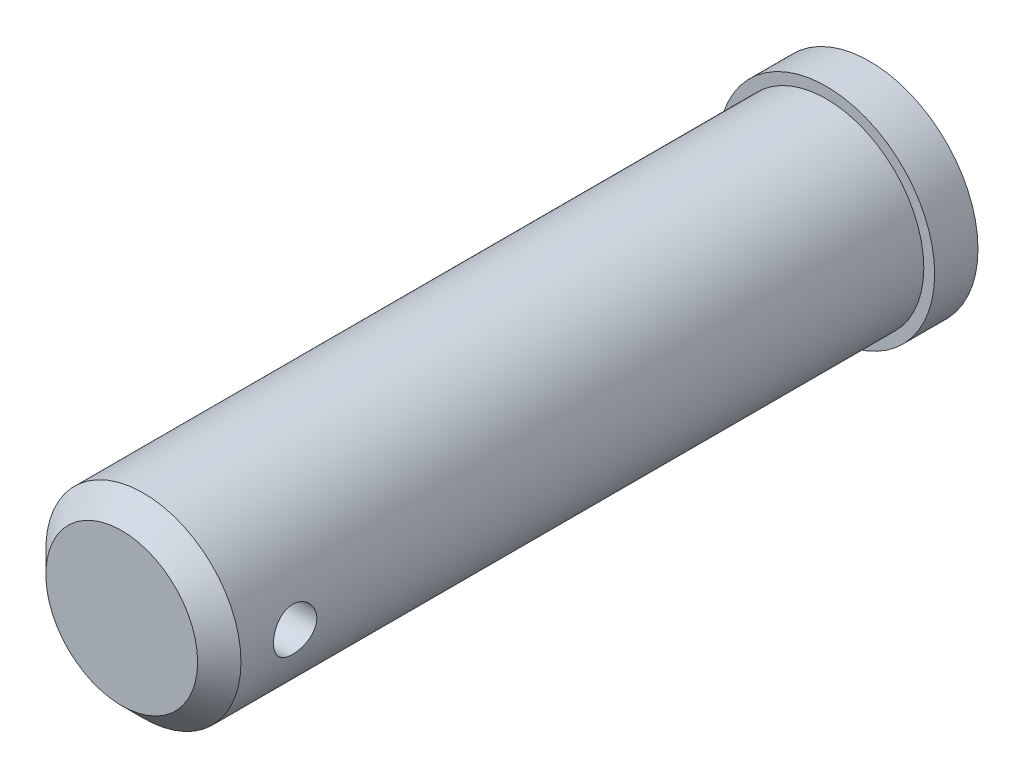
ISO-10303-21;
HEADER;
FILE_DESCRIPTION(('STEP AP214'),'2;1');
FILE_NAME('part.step','',(''),(''),'','','');
FILE_SCHEMA(('AUTOMOTIVE_DESIGN { 1 0 10303 214 1 1 1 1 }'));
ENDSEC;
DATA;
#1=APPLICATION_CONTEXT('core data for automotive mechanical design processes');
#2=APPLICATION_PROTOCOL_DEFINITION('international standard','automotive_design',2000,#1);
#3=PRODUCT_CONTEXT('',#1,'mechanical');
#4=PRODUCT('Part','Part','',(#3));
#5=PRODUCT_RELATED_PRODUCT_CATEGORY('part','',(#4));
#6=PRODUCT_DEFINITION_FORMATION('','',#4);
#7=PRODUCT_DEFINITION_CONTEXT('part definition',#1,'design');
#8=PRODUCT_DEFINITION('design','',#6,#7);
#9=PRODUCT_DEFINITION_SHAPE('','',#8);
#10=(LENGTH_UNIT() NAMED_UNIT(*) SI_UNIT(.MILLI.,.METRE.));
#11=(NAMED_UNIT(*) PLANE_ANGLE_UNIT() SI_UNIT($,.RADIAN.));
#12=(NAMED_UNIT(*) SI_UNIT($,.STERADIAN.) SOLID_ANGLE_UNIT());
#13=UNCERTAINTY_MEASURE_WITH_UNIT(LENGTH_MEASURE(1.E-05),#10,'distance_accuracy_value','');
#14=(GEOMETRIC_REPRESENTATION_CONTEXT(3) GLOBAL_UNCERTAINTY_ASSIGNED_CONTEXT((#13)) GLOBAL_UNIT_ASSIGNED_CONTEXT((#10,
#11,#12)) REPRESENTATION_CONTEXT('',''));
#15=CARTESIAN_POINT('',(0.,0.,0.));
#16=DIRECTION('',(0.,0.,1.));
#17=DIRECTION('',(1.,0.,0.));
#18=AXIS2_PLACEMENT_3D('',#15,#16,#17);
#19=CARTESIAN_POINT('',(0.,0.,69.));
#20=DIRECTION('',(0.,0.,-1.));
#21=DIRECTION('',(-1.,0.,0.));
#22=AXIS2_PLACEMENT_3D('',#19,#20,#21);
#23=CONICAL_SURFACE('',#22,7.,0.785398163397448);
#24=CARTESIAN_POINT('',(0.,0.,69.));
#25=DIRECTION('',(0.,0.,1.));
#26=DIRECTION('',(1.,0.,0.));
#27=AXIS2_PLACEMENT_3D('',#24,#25,#26);
#28=CIRCLE('',#27,7.);
#29=CARTESIAN_POINT('',(7.,0.,69.));
#30=VERTEX_POINT('',#29);
#31=EDGE_CURVE('E61',#30,#30,#28,.T.);
#32=ORIENTED_EDGE('',*,*,#31,.F.);
#33=EDGE_LOOP('',(#32));
#34=FACE_BOUND('',#33,.T.);
#35=CARTESIAN_POINT('',(0.,0.,67.));
#36=DIRECTION('',(0.,0.,1.));
#37=DIRECTION('',(1.,0.,0.));
#38=AXIS2_PLACEMENT_3D('',#35,#36,#37);
#39=CIRCLE('',#38,9.);
#40=CARTESIAN_POINT('',(9.,0.,67.));
#41=VERTEX_POINT('',#40);
#42=EDGE_CURVE('E12',#41,#41,#39,.F.);
#43=ORIENTED_EDGE('',*,*,#42,.F.);
#44=EDGE_LOOP('',(#43));
#45=FACE_BOUND('',#44,.T.);
#46=ADVANCED_FACE('F47',(#34,#45),#23,.T.);
#47=CARTESIAN_POINT('',(0.,0.,4.));
#48=DIRECTION('',(0.,0.,-1.));
#49=DIRECTION('',(-1.,0.,0.));
#50=AXIS2_PLACEMENT_3D('',#47,#48,#49);
#51=CYLINDRICAL_SURFACE('',#50,10.);
#52=CARTESIAN_POINT('',(0.,0.,4.));
#53=DIRECTION('',(0.,0.,1.));
#54=DIRECTION('',(1.,0.,0.));
#55=AXIS2_PLACEMENT_3D('',#52,#53,#54);
#56=CIRCLE('',#55,10.);
#57=CARTESIAN_POINT('',(10.,0.,4.));
#58=VERTEX_POINT('',#57);
#59=EDGE_CURVE('E118',#58,#58,#56,.T.);
#60=ORIENTED_EDGE('',*,*,#59,.F.);
#61=EDGE_LOOP('',(#60));
#62=FACE_BOUND('',#61,.T.);
#63=CARTESIAN_POINT('',(0.,0.,0.));
#64=DIRECTION('',(0.,0.,1.));
#65=DIRECTION('',(1.,0.,0.));
#66=AXIS2_PLACEMENT_3D('',#63,#64,#65);
#67=CIRCLE('',#66,10.);
#68=CARTESIAN_POINT('',(10.,0.,0.));
#69=VERTEX_POINT('',#68);
#70=EDGE_CURVE('E116',#69,#69,#67,.T.);
#71=ORIENTED_EDGE('',*,*,#70,.T.);
#72=EDGE_LOOP('',(#71));
#73=FACE_BOUND('',#72,.T.);
#74=ADVANCED_FACE('F94',(#62,#73),#51,.T.);
#75=CARTESIAN_POINT('',(0.,0.,4.));
#76=DIRECTION('',(0.,0.,1.));
#77=DIRECTION('',(1.,0.,0.));
#78=AXIS2_PLACEMENT_3D('',#75,#76,#77);
#79=PLANE('',#78);
#80=CARTESIAN_POINT('',(0.,0.,4.));
#81=DIRECTION('',(0.,0.,1.));
#82=DIRECTION('',(1.,0.,0.));
#83=AXIS2_PLACEMENT_3D('',#80,#81,#82);
#84=CIRCLE('',#83,9.);
#85=CARTESIAN_POINT('',(9.,0.,4.));
#86=VERTEX_POINT('',#85);
#87=EDGE_CURVE('E67',#86,#86,#84,.T.);
#88=ORIENTED_EDGE('',*,*,#87,.F.);
#89=EDGE_LOOP('',(#88));
#90=FACE_BOUND('',#89,.T.);
#91=ORIENTED_EDGE('',*,*,#59,.T.);
#92=EDGE_LOOP('',(#91));
#93=FACE_BOUND('',#92,.T.);
#94=ADVANCED_FACE('F99',(#90,#93),#79,.T.);
#95=CARTESIAN_POINT('',(0.,0.,0.));
#96=DIRECTION('',(0.,0.,1.));
#97=DIRECTION('',(1.,0.,0.));
#98=AXIS2_PLACEMENT_3D('',#95,#96,#97);
#99=PLANE('',#98);
#100=ORIENTED_EDGE('',*,*,#70,.F.);
#101=EDGE_LOOP('',(#100));
#102=FACE_BOUND('',#101,.T.);
#103=ADVANCED_FACE('F91',(#102),#99,.F.);
#104=CARTESIAN_POINT('',(0.,0.,69.));
#105=DIRECTION('',(0.,0.,-1.));
#106=DIRECTION('',(-1.,0.,0.));
#107=AXIS2_PLACEMENT_3D('',#104,#105,#106);
#108=CYLINDRICAL_SURFACE('',#107,9.);
#109=CARTESIAN_POINT('',(-9.,0.,64.));
#110=CARTESIAN_POINT('',(-8.99999796218252,-0.110880476775649,63.9999962763202));
#111=CARTESIAN_POINT('',(-8.99793013995692,-0.221805565269622,63.9907480183365));
#112=CARTESIAN_POINT('',(-8.9898809775767,-0.440501944103136,63.9540395276495));
#113=CARTESIAN_POINT('',(-8.98389690217348,-0.548270975138989,63.9265665659907));
#114=CARTESIAN_POINT('',(-8.96868113169008,-0.757463277761536,63.8543140295084));
#115=CARTESIAN_POINT('',(-8.95945288439082,-0.858893152100298,63.8095528230021));
#116=CARTESIAN_POINT('',(-8.93874335441377,-1.05280018031378,63.7040533875276));
#117=CARTESIAN_POINT('',(-8.92726211547358,-1.14527750793336,63.6433154687094));
#118=CARTESIAN_POINT('',(-8.9030909417421,-1.32018631401404,63.5065243348933));
#119=CARTESIAN_POINT('',(-8.89038561641427,-1.40244861204354,63.4302574978649));
#120=CARTESIAN_POINT('',(-8.86530601079787,-1.55312491045838,63.2650319399069));
#121=CARTESIAN_POINT('',(-8.85293176088049,-1.62153764410856,63.1760720592895));
#122=CARTESIAN_POINT('',(-8.82976328261711,-1.74332443410351,62.9867281559417));
#123=CARTESIAN_POINT('',(-8.81898875742981,-1.79651742104404,62.8862250419585));
#124=CARTESIAN_POINT('',(-8.80046096352395,-1.88519298954508,62.6774272383076));
#125=CARTESIAN_POINT('',(-8.79270732104771,-1.92067776220096,62.5691335144957));
#126=CARTESIAN_POINT('',(-8.78125609459189,-1.97236858006405,62.3496665226773));
#127=CARTESIAN_POINT('',(-8.77749545807783,-1.98887467038069,62.2385672848946));
#128=CARTESIAN_POINT('',(-8.77426673730669,-2.00307270997673,62.0151177822138));
#129=CARTESIAN_POINT('',(-8.77479810778939,-2.00076704911663,61.9027676780378));
#130=CARTESIAN_POINT('',(-8.78003632148146,-1.97764827517302,61.6822433728062));
#131=CARTESIAN_POINT('',(-8.78466431384841,-1.95718464460217,61.5740303758607));
#132=CARTESIAN_POINT('',(-8.79744954191676,-1.89888490681146,61.362612856675));
#133=CARTESIAN_POINT('',(-8.80560698133176,-1.86104779681652,61.2594086239146));
#134=CARTESIAN_POINT('',(-8.82460909970296,-1.76875672872875,61.0599605616181));
#135=CARTESIAN_POINT('',(-8.8354752436249,-1.71416919379353,60.9637806726639));
#136=CARTESIAN_POINT('',(-8.85865737910744,-1.5900206813985,60.7818171294841));
#137=CARTESIAN_POINT('',(-8.87097357420597,-1.52045760074274,60.6960349381798));
#138=CARTESIAN_POINT('',(-8.89600574612666,-1.36648683702983,60.5352906906515));
#139=CARTESIAN_POINT('',(-8.90872450687872,-1.28178220526623,60.4606132148949));
#140=CARTESIAN_POINT('',(-8.93287839122317,-1.10090661809162,60.3264762710929));
#141=CARTESIAN_POINT('',(-8.94431349008427,-1.00473544183737,60.2670170962181));
#142=CARTESIAN_POINT('',(-8.96465064233607,-0.803303190734731,60.1649307242232));
#143=CARTESIAN_POINT('',(-8.97354693007659,-0.69802212231985,60.1223417556917));
#144=CARTESIAN_POINT('',(-8.98776136366255,-0.481555930981454,60.0555389869421));
#145=CARTESIAN_POINT('',(-8.99308004696785,-0.370371697593364,60.0313224265859));
#146=CARTESIAN_POINT('',(-8.99946317761673,-0.147695483280844,60.0023679867448));
#147=CARTESIAN_POINT('',(-9.0006124862229,-0.0362563973189032,59.9972414998383));
#148=CARTESIAN_POINT('',(-8.99876558650597,0.185885923928082,60.0055581042604));
#149=CARTESIAN_POINT('',(-8.9957696689046,0.296589210270649,60.0189998933195));
#150=CARTESIAN_POINT('',(-8.98602258758613,0.512823257329425,60.0637494151681));
#151=CARTESIAN_POINT('',(-8.97931447007761,0.618398491715488,60.0948524562234));
#152=CARTESIAN_POINT('',(-8.96289421086795,0.822832805855836,60.1738136874451));
#153=CARTESIAN_POINT('',(-8.95318180764659,0.921691300010183,60.221673336306));
#154=CARTESIAN_POINT('',(-8.9316215322764,1.11148643989438,60.333592876799));
#155=CARTESIAN_POINT('',(-8.91974444590247,1.20228573083225,60.3978799430062));
#156=CARTESIAN_POINT('',(-8.8952303234908,1.37194696498812,60.5405312491014));
#157=CARTESIAN_POINT('',(-8.88259318550175,1.45080730173413,60.6188973803321));
#158=CARTESIAN_POINT('',(-8.8576887894581,1.59589548190986,60.7892680335807));
#159=CARTESIAN_POINT('',(-8.84543317664284,1.66185381940074,60.8815040900066));
#160=CARTESIAN_POINT('',(-8.82295395378309,1.77734611922752,61.0759720344108));
#161=CARTESIAN_POINT('',(-8.8127302549527,1.82688079926974,61.1782034853421));
#162=CARTESIAN_POINT('',(-8.79557200548926,1.90778001896259,61.3892082891051));
#163=CARTESIAN_POINT('',(-8.78861879659786,1.93924786354759,61.4979404422688));
#164=CARTESIAN_POINT('',(-8.77875649697392,1.98342027658406,61.7193241848625));
#165=CARTESIAN_POINT('',(-8.77584673547331,1.99612795718357,61.8319751210259));
#166=CARTESIAN_POINT('',(-8.77444401448977,2.00228356641044,62.0552788782783));
#167=CARTESIAN_POINT('',(-8.77585298370124,1.99615913143934,62.1659195080601));
#168=CARTESIAN_POINT('',(-8.78270664957547,1.96578277121688,62.3845497099668));
#169=CARTESIAN_POINT('',(-8.78815129547033,1.9415310740024,62.4925393154235));
#170=CARTESIAN_POINT('',(-8.80241428131525,1.87579819980744,62.7024491202274));
#171=CARTESIAN_POINT('',(-8.8112200518277,1.83438116628454,62.8043903168816));
#172=CARTESIAN_POINT('',(-8.83121764469058,1.73554770348342,62.9999399925467));
#173=CARTESIAN_POINT('',(-8.84240972476633,1.67812954585194,63.093547569964));
#174=CARTESIAN_POINT('',(-8.8662104283533,1.54751358990558,63.271876608948));
#175=CARTESIAN_POINT('',(-8.8788437136774,1.47401185511038,63.3563722049227));
#176=CARTESIAN_POINT('',(-8.90393974173387,1.31392870594504,63.5119700739313));
#177=CARTESIAN_POINT('',(-8.91640244429053,1.22734426623344,63.5830692405084));
#178=CARTESIAN_POINT('',(-8.93995259726581,1.04214597064557,63.7107759829199));
#179=CARTESIAN_POINT('',(-8.95101923499229,0.943385636634951,63.7671751997349));
#180=CARTESIAN_POINT('',(-8.97032058369249,0.737560279778817,63.8624833041812));
#181=CARTESIAN_POINT('',(-8.97855763270815,0.630502203312991,63.9014066400462));
#182=CARTESIAN_POINT('',(-8.98982812909554,0.436138247729405,63.9538413502768));
#183=CARTESIAN_POINT('',(-8.9936186902321,0.349871991901679,63.9711173736663));
#184=CARTESIAN_POINT('',(-8.99870537459789,0.175746449894527,63.9941979043062));
#185=CARTESIAN_POINT('',(-9.00000161523613,0.0878872388928777,64.0000029515019));
#186=CARTESIAN_POINT('',(-9.,0.,64.));
#187=B_SPLINE_CURVE_WITH_KNOTS('',3,(#109,#110,#111,#112,#113,#114,#115,#116,#117,#118,#119,
#120,#121,#122,#123,#124,#125,#126,#127,#128,#129,#130,#131,#132,#133,#134,#135,#136,#137,#138,
#139,#140,#141,#142,#143,#144,#145,#146,#147,#148,#149,#150,#151,#152,#153,#154,#155,#156,#157,
#158,#159,#160,#161,#162,#163,#164,#165,#166,#167,#168,#169,#170,#171,#172,#173,#174,#175,#176,
#177,#178,#179,#180,#181,#182,#183,#184,#185,#186),.UNSPECIFIED.,.T.,.F.,(4,2,2,2,2,2,2,2,2,2,2,
2,2,2,2,2,2,2,2,2,2,2,2,2,2,2,2,2,2,2,2,2,2,2,2,2,2,2,4),(0.,0.332319689729797,
0.664871731249287,0.99707141240748,1.3292646451699,1.6663807200208,2.00352761490515,
2.34453296297978,2.6854961068774,3.02099125638107,3.35644378496592,3.68557668145785,
4.0147285774694,4.34657669709582,4.67847145258301,5.01778179808978,5.35709867969829,
5.69718012811239,6.03721047501989,6.3702799212427,6.70332600912268,7.03258869425168,
7.36188004945461,7.69599803262042,8.03016093387758,8.3706947310573,8.71121364510412,
9.04976559055244,9.38826136686412,9.71912785142418,10.0499901738286,10.3796271201578,
10.7092996858639,11.0458432631283,11.3824647846641,11.7236258704957,12.0645043787094,
12.3279234735856,12.5913301688795),.UNSPECIFIED.);
#188=CARTESIAN_POINT('',(-9.,0.,64.));
#189=VERTEX_POINT('',#188);
#190=EDGE_CURVE('E51',#189,#189,#187,.T.);
#191=ORIENTED_EDGE('',*,*,#190,.T.);
#192=EDGE_LOOP('',(#191));
#193=FACE_BOUND('',#192,.T.);
#194=CARTESIAN_POINT('',(9.,0.,60.));
#195=CARTESIAN_POINT('',(8.99999796218252,-0.110880476775649,60.0000037236798));
#196=CARTESIAN_POINT('',(8.99793013995692,-0.221805565269621,60.0092519816635));
#197=CARTESIAN_POINT('',(8.9898809775767,-0.440501944103135,60.0459604723506));
#198=CARTESIAN_POINT('',(8.98389690217348,-0.548270975138988,60.0734334340093));
#199=CARTESIAN_POINT('',(8.96868113169008,-0.757463277761528,60.1456859704916));
#200=CARTESIAN_POINT('',(8.95945288439083,-0.858893152100283,60.1904471769979));
#201=CARTESIAN_POINT('',(8.93874335441378,-1.05280018031376,60.2959466124724));
#202=CARTESIAN_POINT('',(8.92726211547358,-1.14527750793335,60.3566845312906));
#203=CARTESIAN_POINT('',(8.9030909417421,-1.32018631401404,60.4934756651067));
#204=CARTESIAN_POINT('',(8.89038561641427,-1.40244861204354,60.5697425021351));
#205=CARTESIAN_POINT('',(8.86530601079787,-1.55312491045838,60.7349680600931));
#206=CARTESIAN_POINT('',(8.85293176088049,-1.62153764410856,60.8239279407105));
#207=CARTESIAN_POINT('',(8.82976328261711,-1.74332443410351,61.0132718440583));
#208=CARTESIAN_POINT('',(8.81898875742981,-1.79651742104404,61.1137749580415));
#209=CARTESIAN_POINT('',(8.80046096352395,-1.88519298954508,61.3225727616924));
#210=CARTESIAN_POINT('',(8.79270732104771,-1.92067776220096,61.4308664855042));
#211=CARTESIAN_POINT('',(8.78125609459189,-1.97236858006405,61.6503334773227));
#212=CARTESIAN_POINT('',(8.77749545807783,-1.98887467038069,61.7614327151054));
#213=CARTESIAN_POINT('',(8.77426673730669,-2.00307270997673,61.9848822177862));
#214=CARTESIAN_POINT('',(8.77479810778939,-2.00076704911663,62.0972323219621));
#215=CARTESIAN_POINT('',(8.78003632148146,-1.97764827517302,62.3177566271938));
#216=CARTESIAN_POINT('',(8.78466431384841,-1.95718464460217,62.4259696241393));
#217=CARTESIAN_POINT('',(8.79744954191676,-1.89888490681146,62.637387143325));
#218=CARTESIAN_POINT('',(8.80560698133176,-1.86104779681652,62.7405913760854));
#219=CARTESIAN_POINT('',(8.82460909970296,-1.76875672872875,62.9400394383819));
#220=CARTESIAN_POINT('',(8.8354752436249,-1.71416919379352,63.0362193273361));
#221=CARTESIAN_POINT('',(8.85865737910744,-1.59002068139849,63.2181828705159));
#222=CARTESIAN_POINT('',(8.87097357420597,-1.52045760074274,63.3039650618202));
#223=CARTESIAN_POINT('',(8.89600574612666,-1.36648683702982,63.4647093093485));
#224=CARTESIAN_POINT('',(8.90872450687872,-1.28178220526623,63.5393867851051));
#225=CARTESIAN_POINT('',(8.93287839122317,-1.10090661809162,63.6735237289071));
#226=CARTESIAN_POINT('',(8.94431349008427,-1.00473544183737,63.7329829037819));
#227=CARTESIAN_POINT('',(8.96465064233607,-0.803303190734734,63.8350692757768));
#228=CARTESIAN_POINT('',(8.97354693007659,-0.698022122319853,63.8776582443083));
#229=CARTESIAN_POINT('',(8.98776136366255,-0.481555930981454,63.9444610130579));
#230=CARTESIAN_POINT('',(8.99308004696785,-0.370371697593362,63.9686775734141));
#231=CARTESIAN_POINT('',(8.99946317761673,-0.147695483280841,63.9976320132552));
#232=CARTESIAN_POINT('',(9.0006124862229,-0.0362563973189019,64.0027585001617));
#233=CARTESIAN_POINT('',(8.99876558650597,0.185885923928081,63.9944418957396));
#234=CARTESIAN_POINT('',(8.9957696689046,0.296589210270646,63.9810001066805));
#235=CARTESIAN_POINT('',(8.98602258758613,0.51282325732942,63.9362505848319));
#236=CARTESIAN_POINT('',(8.97931447007761,0.618398491715482,63.9051475437766));
#237=CARTESIAN_POINT('',(8.96289421086795,0.82283280585583,63.8261863125549));
#238=CARTESIAN_POINT('',(8.95318180764659,0.921691300010177,63.778326663694));
#239=CARTESIAN_POINT('',(8.9316215322764,1.11148643989438,63.666407123201));
#240=CARTESIAN_POINT('',(8.91974444590247,1.20228573083225,63.6021200569938));
#241=CARTESIAN_POINT('',(8.8952303234908,1.37194696498812,63.4594687508986));
#242=CARTESIAN_POINT('',(8.88259318550175,1.45080730173413,63.3811026196679));
#243=CARTESIAN_POINT('',(8.8576887894581,1.59589548190986,63.2107319664193));
#244=CARTESIAN_POINT('',(8.84543317664284,1.66185381940074,63.1184959099934));
#245=CARTESIAN_POINT('',(8.82295395378309,1.77734611922753,62.9240279655892));
#246=CARTESIAN_POINT('',(8.8127302549527,1.82688079926974,62.8217965146579));
#247=CARTESIAN_POINT('',(8.79557200548926,1.90778001896259,62.6107917108949));
#248=CARTESIAN_POINT('',(8.78861879659786,1.93924786354759,62.5020595577312));
#249=CARTESIAN_POINT('',(8.77875649697391,1.98342027658406,62.2806758151375));
#250=CARTESIAN_POINT('',(8.77584673547331,1.99612795718356,62.1680248789741));
#251=CARTESIAN_POINT('',(8.77444401448977,2.00228356641044,61.9447211217217));
#252=CARTESIAN_POINT('',(8.77585298370124,1.99615913143934,61.8340804919399));
#253=CARTESIAN_POINT('',(8.78270664957547,1.96578277121688,61.6154502900332));
#254=CARTESIAN_POINT('',(8.78815129547033,1.9415310740024,61.5074606845765));
#255=CARTESIAN_POINT('',(8.80241428131525,1.87579819980745,61.2975508797726));
#256=CARTESIAN_POINT('',(8.81122005182769,1.83438116628454,61.1956096831184));
#257=CARTESIAN_POINT('',(8.83121764469058,1.73554770348342,61.0000600074533));
#258=CARTESIAN_POINT('',(8.84240972476633,1.67812954585194,60.906452430036));
#259=CARTESIAN_POINT('',(8.86621042835329,1.54751358990558,60.728123391052));
#260=CARTESIAN_POINT('',(8.8788437136774,1.47401185511039,60.6436277950774));
#261=CARTESIAN_POINT('',(8.90393974173387,1.31392870594505,60.4880299260687));
#262=CARTESIAN_POINT('',(8.91640244429053,1.22734426623344,60.4169307594916));
#263=CARTESIAN_POINT('',(8.93995259726581,1.04214597064557,60.2892240170801));
#264=CARTESIAN_POINT('',(8.95101923499229,0.943385636634951,60.2328248002651));
#265=CARTESIAN_POINT('',(8.97032058369249,0.737560279778818,60.1375166958188));
#266=CARTESIAN_POINT('',(8.97855763270815,0.630502203312994,60.0985933599538));
#267=CARTESIAN_POINT('',(8.98982812909554,0.436138247729408,60.0461586497232));
#268=CARTESIAN_POINT('',(8.9936186902321,0.34987199190168,60.0288826263337));
#269=CARTESIAN_POINT('',(8.99870537459789,0.175746449894527,60.0058020956938));
#270=CARTESIAN_POINT('',(9.00000161523613,0.0878872388928777,59.9999970484981));
#271=CARTESIAN_POINT('',(9.,0.,60.));
#272=B_SPLINE_CURVE_WITH_KNOTS('',3,(#194,#195,#196,#197,#198,#199,#200,#201,#202,#203,#204,
#205,#206,#207,#208,#209,#210,#211,#212,#213,#214,#215,#216,#217,#218,#219,#220,#221,#222,#223,
#224,#225,#226,#227,#228,#229,#230,#231,#232,#233,#234,#235,#236,#237,#238,#239,#240,#241,#242,
#243,#244,#245,#246,#247,#248,#249,#250,#251,#252,#253,#254,#255,#256,#257,#258,#259,#260,#261,
#262,#263,#264,#265,#266,#267,#268,#269,#270,#271),.UNSPECIFIED.,.T.,.F.,(4,2,2,2,2,2,2,2,2,2,2,
2,2,2,2,2,2,2,2,2,2,2,2,2,2,2,2,2,2,2,2,2,2,2,2,2,2,2,4),(0.,0.332319689729798,
0.664871731249284,0.997071412407457,1.32926464516989,1.66638072002079,2.00352761490515,
2.34453296297976,2.6854961068774,3.02099125638107,3.35644378496591,3.68557668145785,
4.01472857746941,4.34657669709583,4.67847145258302,5.01778179808978,5.35709867969829,
5.69718012811238,6.03721047501989,6.3702799212427,6.70332600912268,7.03258869425167,
7.3618800494546,7.69599803262042,8.03016093387757,8.3706947310573,8.71121364510413,
9.04976559055246,9.38826136686411,9.71912785142417,10.0499901738286,10.3796271201578,
10.7092996858639,11.0458432631283,11.3824647846641,11.7236258704957,12.0645043787094,
12.3279234735856,12.5913301688795),.UNSPECIFIED.);
#273=CARTESIAN_POINT('',(9.,0.,60.));
#274=VERTEX_POINT('',#273);
#275=EDGE_CURVE('E70',#274,#274,#272,.T.);
#276=ORIENTED_EDGE('',*,*,#275,.T.);
#277=EDGE_LOOP('',(#276));
#278=FACE_BOUND('',#277,.T.);
#279=ORIENTED_EDGE('',*,*,#42,.T.);
#280=EDGE_LOOP('',(#279));
#281=FACE_BOUND('',#280,.T.);
#282=ORIENTED_EDGE('',*,*,#87,.T.);
#283=EDGE_LOOP('',(#282));
#284=FACE_BOUND('',#283,.T.);
#285=ADVANCED_FACE('F76',(#193,#278,#281,#284),#108,.T.);
#286=CARTESIAN_POINT('',(0.,0.,69.));
#287=DIRECTION('',(0.,0.,1.));
#288=DIRECTION('',(1.,0.,0.));
#289=AXIS2_PLACEMENT_3D('',#286,#287,#288);
#290=PLANE('',#289);
#291=ORIENTED_EDGE('',*,*,#31,.T.);
#292=EDGE_LOOP('',(#291));
#293=FACE_BOUND('',#292,.T.);
#294=ADVANCED_FACE('F83',(#293),#290,.T.);
#295=CARTESIAN_POINT('',(-32.5,0.,62.));
#296=DIRECTION('',(1.,0.,0.));
#297=DIRECTION('',(0.,0.,-1.));
#298=AXIS2_PLACEMENT_3D('',#295,#296,#297);
#299=CYLINDRICAL_SURFACE('',#298,2.);
#300=ORIENTED_EDGE('',*,*,#275,.F.);
#301=EDGE_LOOP('',(#300));
#302=FACE_BOUND('',#301,.T.);
#303=ORIENTED_EDGE('',*,*,#190,.F.);
#304=EDGE_LOOP('',(#303));
#305=FACE_BOUND('',#304,.T.);
#306=ADVANCED_FACE('F80',(#302,#305),#299,.F.);
#307=CLOSED_SHELL('',(#46,#74,#94,#103,#285,#294,#306));
#308=MANIFOLD_SOLID_BREP('B2',#307);
#309=ADVANCED_BREP_SHAPE_REPRESENTATION('',(#18,#308),#14);
#310=SHAPE_DEFINITION_REPRESENTATION(#9,#309);
ENDSEC;
END-ISO-10303-21;
